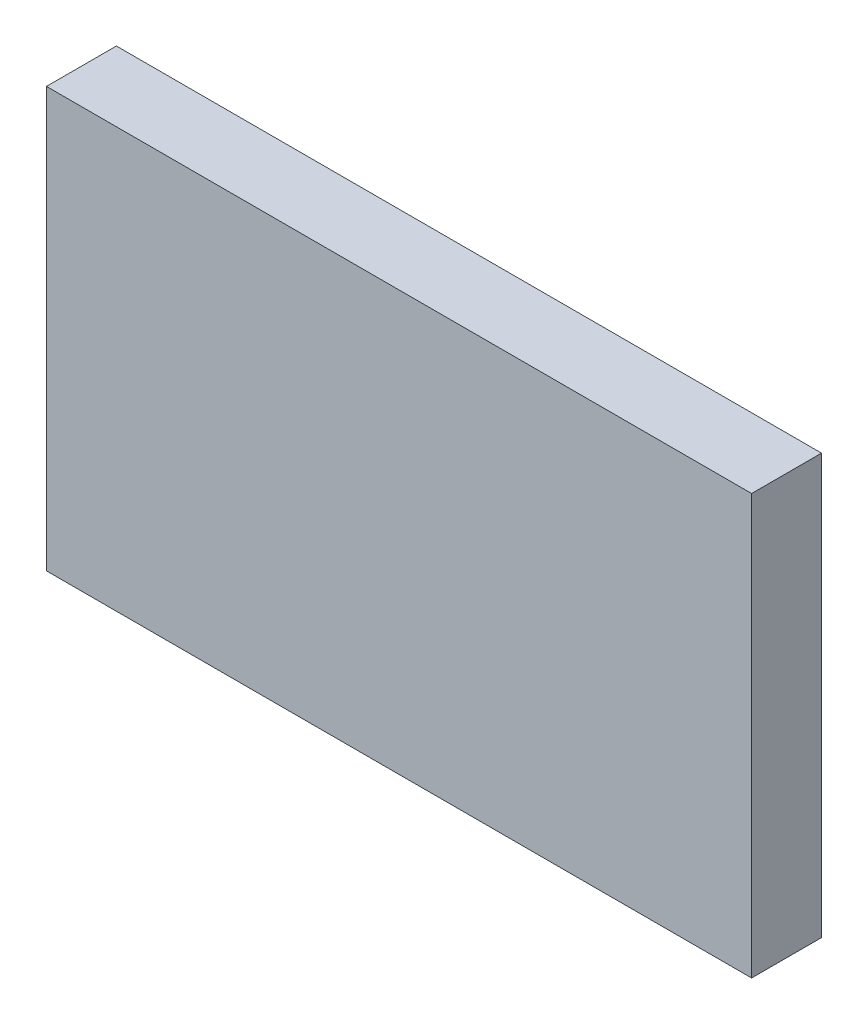
ISO-10303-21;
HEADER;
FILE_DESCRIPTION(('STEP AP214'),'2;1');
FILE_NAME('part.step','',(''),(''),'','','');
FILE_SCHEMA(('AUTOMOTIVE_DESIGN { 1 0 10303 214 1 1 1 1 }'));
ENDSEC;
DATA;
#1=APPLICATION_CONTEXT('core data for automotive mechanical design processes');
#2=APPLICATION_PROTOCOL_DEFINITION('international standard','automotive_design',2000,#1);
#3=PRODUCT_CONTEXT('',#1,'mechanical');
#4=PRODUCT('Part','Part','',(#3));
#5=PRODUCT_RELATED_PRODUCT_CATEGORY('part','',(#4));
#6=PRODUCT_DEFINITION_FORMATION('','',#4);
#7=PRODUCT_DEFINITION_CONTEXT('part definition',#1,'design');
#8=PRODUCT_DEFINITION('design','',#6,#7);
#9=PRODUCT_DEFINITION_SHAPE('','',#8);
#10=(LENGTH_UNIT() NAMED_UNIT(*) SI_UNIT(.MILLI.,.METRE.));
#11=(NAMED_UNIT(*) PLANE_ANGLE_UNIT() SI_UNIT($,.RADIAN.));
#12=(NAMED_UNIT(*) SI_UNIT($,.STERADIAN.) SOLID_ANGLE_UNIT());
#13=UNCERTAINTY_MEASURE_WITH_UNIT(LENGTH_MEASURE(1.E-05),#10,'distance_accuracy_value','');
#14=(GEOMETRIC_REPRESENTATION_CONTEXT(3) GLOBAL_UNCERTAINTY_ASSIGNED_CONTEXT((#13)) GLOBAL_UNIT_ASSIGNED_CONTEXT((#10,
#11,#12)) REPRESENTATION_CONTEXT('',''));
#15=CARTESIAN_POINT('',(0.,0.,0.));
#16=DIRECTION('',(0.,0.,1.));
#17=DIRECTION('',(1.,0.,0.));
#18=AXIS2_PLACEMENT_3D('',#15,#16,#17);
#19=CARTESIAN_POINT('',(-30.25,18.,6.));
#20=DIRECTION('',(1.,0.,0.));
#21=DIRECTION('',(0.,0.,-1.));
#22=AXIS2_PLACEMENT_3D('',#19,#20,#21);
#23=PLANE('',#22);
#24=DIRECTION('',(0.,-1.,0.));
#25=VECTOR('',#24,1.);
#26=CARTESIAN_POINT('',(-30.25,18.,0.));
#27=LINE('',#26,#25);
#28=CARTESIAN_POINT('',(-30.25,18.,0.));
#29=VERTEX_POINT('',#28);
#30=CARTESIAN_POINT('',(-30.25,-18.,0.));
#31=VERTEX_POINT('',#30);
#32=EDGE_CURVE('E96',#29,#31,#27,.T.);
#33=ORIENTED_EDGE('',*,*,#32,.T.);
#34=DIRECTION('',(0.,0.,-1.));
#35=VECTOR('',#34,1.);
#36=CARTESIAN_POINT('',(-30.25,-18.,6.));
#37=LINE('',#36,#35);
#38=CARTESIAN_POINT('',(-30.25,-18.,6.));
#39=VERTEX_POINT('',#38);
#40=EDGE_CURVE('E11',#39,#31,#37,.T.);
#41=ORIENTED_EDGE('',*,*,#40,.F.);
#42=DIRECTION('',(0.,-1.,0.));
#43=VECTOR('',#42,1.);
#44=CARTESIAN_POINT('',(-30.25,18.,6.));
#45=LINE('',#44,#43);
#46=CARTESIAN_POINT('',(-30.25,18.,6.));
#47=VERTEX_POINT('',#46);
#48=EDGE_CURVE('E84',#47,#39,#45,.T.);
#49=ORIENTED_EDGE('',*,*,#48,.F.);
#50=DIRECTION('',(0.,0.,-1.));
#51=VECTOR('',#50,1.);
#52=CARTESIAN_POINT('',(-30.25,18.,6.));
#53=LINE('',#52,#51);
#54=EDGE_CURVE('E92',#47,#29,#53,.T.);
#55=ORIENTED_EDGE('',*,*,#54,.T.);
#56=EDGE_LOOP('',(#33,#41,#49,#55));
#57=FACE_BOUND('',#56,.T.);
#58=ADVANCED_FACE('F33',(#57),#23,.F.);
#59=CARTESIAN_POINT('',(30.25,-18.,6.));
#60=DIRECTION('',(0.,1.,0.));
#61=DIRECTION('',(0.,0.,1.));
#62=AXIS2_PLACEMENT_3D('',#59,#60,#61);
#63=PLANE('',#62);
#64=DIRECTION('',(1.,0.,0.));
#65=VECTOR('',#64,1.);
#66=CARTESIAN_POINT('',(30.25,-18.,0.));
#67=LINE('',#66,#65);
#68=CARTESIAN_POINT('',(30.25,-18.,0.));
#69=VERTEX_POINT('',#68);
#70=EDGE_CURVE('E88',#31,#69,#67,.T.);
#71=ORIENTED_EDGE('',*,*,#70,.T.);
#72=DIRECTION('',(0.,0.,-1.));
#73=VECTOR('',#72,1.);
#74=CARTESIAN_POINT('',(30.25,-18.,6.));
#75=LINE('',#74,#73);
#76=CARTESIAN_POINT('',(30.25,-18.,6.));
#77=VERTEX_POINT('',#76);
#78=EDGE_CURVE('E41',#77,#69,#75,.T.);
#79=ORIENTED_EDGE('',*,*,#78,.F.);
#80=DIRECTION('',(1.,0.,0.));
#81=VECTOR('',#80,1.);
#82=CARTESIAN_POINT('',(30.25,-18.,6.));
#83=LINE('',#82,#81);
#84=EDGE_CURVE('E79',#39,#77,#83,.T.);
#85=ORIENTED_EDGE('',*,*,#84,.F.);
#86=ORIENTED_EDGE('',*,*,#40,.T.);
#87=EDGE_LOOP('',(#71,#79,#85,#86));
#88=FACE_BOUND('',#87,.T.);
#89=ADVANCED_FACE('F87',(#88),#63,.F.);
#90=CARTESIAN_POINT('',(30.25,18.,6.));
#91=DIRECTION('',(-1.,0.,0.));
#92=DIRECTION('',(0.,0.,1.));
#93=AXIS2_PLACEMENT_3D('',#90,#91,#92);
#94=PLANE('',#93);
#95=DIRECTION('',(0.,1.,0.));
#96=VECTOR('',#95,1.);
#97=CARTESIAN_POINT('',(30.25,18.,0.));
#98=LINE('',#97,#96);
#99=CARTESIAN_POINT('',(30.25,18.,0.));
#100=VERTEX_POINT('',#99);
#101=EDGE_CURVE('E66',#69,#100,#98,.T.);
#102=ORIENTED_EDGE('',*,*,#101,.T.);
#103=DIRECTION('',(0.,0.,-1.));
#104=VECTOR('',#103,1.);
#105=CARTESIAN_POINT('',(30.25,18.,6.));
#106=LINE('',#105,#104);
#107=CARTESIAN_POINT('',(30.25,18.,6.));
#108=VERTEX_POINT('',#107);
#109=EDGE_CURVE('E89',#108,#100,#106,.T.);
#110=ORIENTED_EDGE('',*,*,#109,.F.);
#111=DIRECTION('',(0.,1.,0.));
#112=VECTOR('',#111,1.);
#113=CARTESIAN_POINT('',(30.25,18.,6.));
#114=LINE('',#113,#112);
#115=EDGE_CURVE('E82',#77,#108,#114,.T.);
#116=ORIENTED_EDGE('',*,*,#115,.F.);
#117=ORIENTED_EDGE('',*,*,#78,.T.);
#118=EDGE_LOOP('',(#102,#110,#116,#117));
#119=FACE_BOUND('',#118,.T.);
#120=ADVANCED_FACE('F90',(#119),#94,.F.);
#121=CARTESIAN_POINT('',(30.25,18.,6.));
#122=DIRECTION('',(0.,-1.,0.));
#123=DIRECTION('',(0.,0.,-1.));
#124=AXIS2_PLACEMENT_3D('',#121,#122,#123);
#125=PLANE('',#124);
#126=DIRECTION('',(-1.,0.,0.));
#127=VECTOR('',#126,1.);
#128=CARTESIAN_POINT('',(30.25,18.,0.));
#129=LINE('',#128,#127);
#130=EDGE_CURVE('E72',#100,#29,#129,.T.);
#131=ORIENTED_EDGE('',*,*,#130,.T.);
#132=ORIENTED_EDGE('',*,*,#54,.F.);
#133=DIRECTION('',(-1.,0.,0.));
#134=VECTOR('',#133,1.);
#135=CARTESIAN_POINT('',(30.25,18.,6.));
#136=LINE('',#135,#134);
#137=EDGE_CURVE('E49',#108,#47,#136,.T.);
#138=ORIENTED_EDGE('',*,*,#137,.F.);
#139=ORIENTED_EDGE('',*,*,#109,.T.);
#140=EDGE_LOOP('',(#131,#132,#138,#139));
#141=FACE_BOUND('',#140,.T.);
#142=ADVANCED_FACE('F103',(#141),#125,.F.);
#143=CARTESIAN_POINT('',(0.,0.,6.));
#144=DIRECTION('',(0.,0.,-1.));
#145=DIRECTION('',(-1.,0.,0.));
#146=AXIS2_PLACEMENT_3D('',#143,#144,#145);
#147=PLANE('',#146);
#148=ORIENTED_EDGE('',*,*,#48,.T.);
#149=ORIENTED_EDGE('',*,*,#84,.T.);
#150=ORIENTED_EDGE('',*,*,#115,.T.);
#151=ORIENTED_EDGE('',*,*,#137,.T.);
#152=EDGE_LOOP('',(#148,#149,#150,#151));
#153=FACE_BOUND('',#152,.T.);
#154=ADVANCED_FACE('F80',(#153),#147,.F.);
#155=CARTESIAN_POINT('',(0.,0.,0.));
#156=DIRECTION('',(0.,0.,-1.));
#157=DIRECTION('',(-1.,0.,0.));
#158=AXIS2_PLACEMENT_3D('',#155,#156,#157);
#159=PLANE('',#158);
#160=ORIENTED_EDGE('',*,*,#32,.F.);
#161=ORIENTED_EDGE('',*,*,#130,.F.);
#162=ORIENTED_EDGE('',*,*,#101,.F.);
#163=ORIENTED_EDGE('',*,*,#70,.F.);
#164=EDGE_LOOP('',(#160,#161,#162,#163));
#165=FACE_BOUND('',#164,.T.);
#166=ADVANCED_FACE('F106',(#165),#159,.T.);
#167=CLOSED_SHELL('',(#58,#89,#120,#142,#154,#166));
#168=MANIFOLD_SOLID_BREP('B2',#167);
#169=ADVANCED_BREP_SHAPE_REPRESENTATION('',(#18,#168),#14);
#170=SHAPE_DEFINITION_REPRESENTATION(#9,#169);
ENDSEC;
END-ISO-10303-21;
